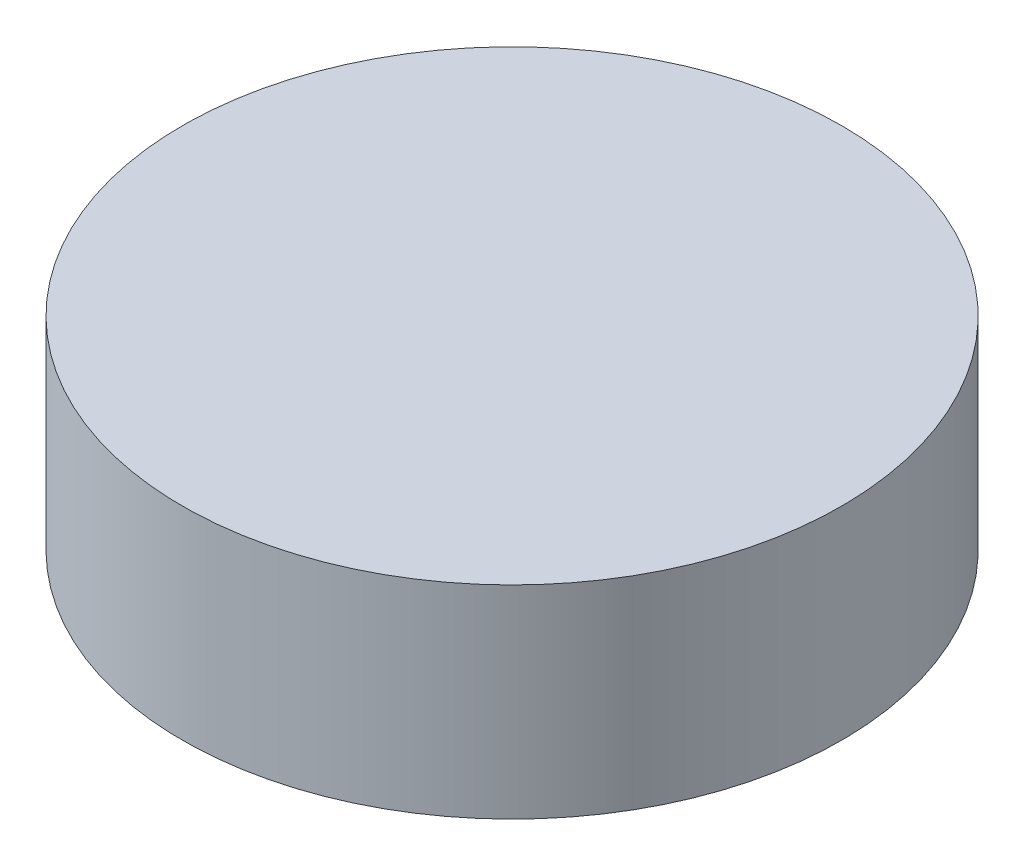
ISO-10303-21;
HEADER;
FILE_DESCRIPTION(('STEP AP214'),'2;1');
FILE_NAME('part.step','',(''),(''),'','','');
FILE_SCHEMA(('AUTOMOTIVE_DESIGN { 1 0 10303 214 1 1 1 1 }'));
ENDSEC;
DATA;
#1=APPLICATION_CONTEXT('core data for automotive mechanical design processes');
#2=APPLICATION_PROTOCOL_DEFINITION('international standard','automotive_design',2000,#1);
#3=PRODUCT_CONTEXT('',#1,'mechanical');
#4=PRODUCT('Part','Part','',(#3));
#5=PRODUCT_RELATED_PRODUCT_CATEGORY('part','',(#4));
#6=PRODUCT_DEFINITION_FORMATION('','',#4);
#7=PRODUCT_DEFINITION_CONTEXT('part definition',#1,'design');
#8=PRODUCT_DEFINITION('design','',#6,#7);
#9=PRODUCT_DEFINITION_SHAPE('','',#8);
#10=(LENGTH_UNIT() NAMED_UNIT(*) SI_UNIT(.MILLI.,.METRE.));
#11=(NAMED_UNIT(*) PLANE_ANGLE_UNIT() SI_UNIT($,.RADIAN.));
#12=(NAMED_UNIT(*) SI_UNIT($,.STERADIAN.) SOLID_ANGLE_UNIT());
#13=UNCERTAINTY_MEASURE_WITH_UNIT(LENGTH_MEASURE(1.E-05),#10,'distance_accuracy_value','');
#14=(GEOMETRIC_REPRESENTATION_CONTEXT(3) GLOBAL_UNCERTAINTY_ASSIGNED_CONTEXT((#13)) GLOBAL_UNIT_ASSIGNED_CONTEXT((#10,
#11,#12)) REPRESENTATION_CONTEXT('',''));
#15=CARTESIAN_POINT('',(0.,0.,0.));
#16=DIRECTION('',(0.,0.,1.));
#17=DIRECTION('',(1.,0.,0.));
#18=AXIS2_PLACEMENT_3D('',#15,#16,#17);
#19=CARTESIAN_POINT('',(0.,0.,0.));
#20=DIRECTION('',(0.,-1.,0.));
#21=DIRECTION('',(0.,0.,-1.));
#22=AXIS2_PLACEMENT_3D('',#19,#20,#21);
#23=PLANE('',#22);
#24=CARTESIAN_POINT('',(0.,0.,0.));
#25=DIRECTION('',(0.,-1.,0.));
#26=DIRECTION('',(0.,0.,-1.));
#27=AXIS2_PLACEMENT_3D('',#24,#25,#26);
#28=CIRCLE('',#27,6.5);
#29=CARTESIAN_POINT('',(0.,0.,-6.5));
#30=VERTEX_POINT('',#29);
#31=EDGE_CURVE('E10',#30,#30,#28,.T.);
#32=ORIENTED_EDGE('',*,*,#31,.T.);
#33=EDGE_LOOP('',(#32));
#34=FACE_BOUND('',#33,.T.);
#35=ADVANCED_FACE('F37',(#34),#23,.T.);
#36=CARTESIAN_POINT('',(0.,0.,0.));
#37=DIRECTION('',(0.,-1.,0.));
#38=DIRECTION('',(0.,0.,-1.));
#39=AXIS2_PLACEMENT_3D('',#36,#37,#38);
#40=CYLINDRICAL_SURFACE('',#39,6.5);
#41=CARTESIAN_POINT('',(0.,4.,0.));
#42=DIRECTION('',(0.,-1.,0.));
#43=DIRECTION('',(0.,0.,-1.));
#44=AXIS2_PLACEMENT_3D('',#41,#42,#43);
#45=CIRCLE('',#44,6.5);
#46=CARTESIAN_POINT('',(0.,4.,-6.5));
#47=VERTEX_POINT('',#46);
#48=EDGE_CURVE('E43',#47,#47,#45,.T.);
#49=ORIENTED_EDGE('',*,*,#48,.T.);
#50=EDGE_LOOP('',(#49));
#51=FACE_BOUND('',#50,.T.);
#52=ORIENTED_EDGE('',*,*,#31,.F.);
#53=EDGE_LOOP('',(#52));
#54=FACE_BOUND('',#53,.T.);
#55=ADVANCED_FACE('F49',(#51,#54),#40,.T.);
#56=CARTESIAN_POINT('',(6.5,4.,0.));
#57=DIRECTION('',(0.,1.,0.));
#58=DIRECTION('',(0.,0.,1.));
#59=AXIS2_PLACEMENT_3D('',#56,#57,#58);
#60=PLANE('',#59);
#61=ORIENTED_EDGE('',*,*,#48,.F.);
#62=EDGE_LOOP('',(#61));
#63=FACE_BOUND('',#62,.T.);
#64=ADVANCED_FACE('F52',(#63),#60,.T.);
#65=CLOSED_SHELL('',(#35,#55,#64));
#66=MANIFOLD_SOLID_BREP('B2',#65);
#67=ADVANCED_BREP_SHAPE_REPRESENTATION('',(#18,#66),#14);
#68=SHAPE_DEFINITION_REPRESENTATION(#9,#67);
ENDSEC;
END-ISO-10303-21;
